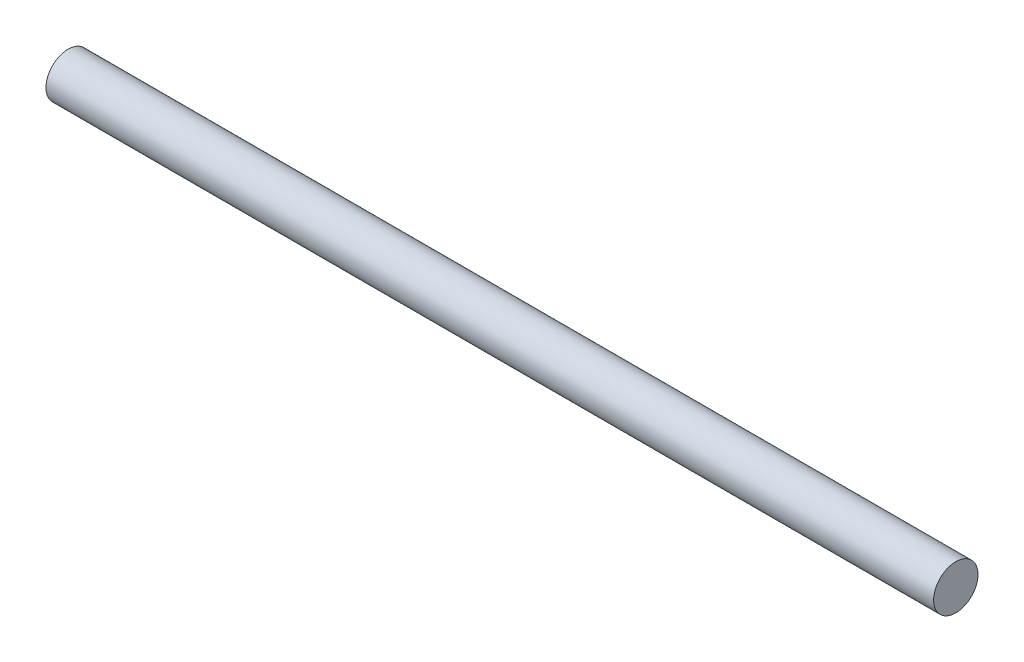
ISO-10303-21;
HEADER;
FILE_DESCRIPTION(('STEP AP214'),'2;1');
FILE_NAME('part.step','',(''),(''),'','','');
FILE_SCHEMA(('AUTOMOTIVE_DESIGN { 1 0 10303 214 1 1 1 1 }'));
ENDSEC;
DATA;
#1=APPLICATION_CONTEXT('core data for automotive mechanical design processes');
#2=APPLICATION_PROTOCOL_DEFINITION('international standard','automotive_design',2000,#1);
#3=PRODUCT_CONTEXT('',#1,'mechanical');
#4=PRODUCT('Part','Part','',(#3));
#5=PRODUCT_RELATED_PRODUCT_CATEGORY('part','',(#4));
#6=PRODUCT_DEFINITION_FORMATION('','',#4);
#7=PRODUCT_DEFINITION_CONTEXT('part definition',#1,'design');
#8=PRODUCT_DEFINITION('design','',#6,#7);
#9=PRODUCT_DEFINITION_SHAPE('','',#8);
#10=(LENGTH_UNIT() NAMED_UNIT(*) SI_UNIT(.MILLI.,.METRE.));
#11=(NAMED_UNIT(*) PLANE_ANGLE_UNIT() SI_UNIT($,.RADIAN.));
#12=(NAMED_UNIT(*) SI_UNIT($,.STERADIAN.) SOLID_ANGLE_UNIT());
#13=UNCERTAINTY_MEASURE_WITH_UNIT(LENGTH_MEASURE(1.E-05),#10,'distance_accuracy_value','');
#14=(GEOMETRIC_REPRESENTATION_CONTEXT(3) GLOBAL_UNCERTAINTY_ASSIGNED_CONTEXT((#13)) GLOBAL_UNIT_ASSIGNED_CONTEXT((#10,
#11,#12)) REPRESENTATION_CONTEXT('',''));
#15=CARTESIAN_POINT('',(0.,0.,0.));
#16=DIRECTION('',(0.,0.,1.));
#17=DIRECTION('',(1.,0.,0.));
#18=AXIS2_PLACEMENT_3D('',#15,#16,#17);
#19=CARTESIAN_POINT('',(508.,0.,0.));
#20=DIRECTION('',(-1.,0.,0.));
#21=DIRECTION('',(0.,0.,1.));
#22=AXIS2_PLACEMENT_3D('',#19,#20,#21);
#23=CYLINDRICAL_SURFACE('',#22,12.7);
#24=CARTESIAN_POINT('',(508.,0.,0.));
#25=DIRECTION('',(1.,0.,0.));
#26=DIRECTION('',(0.,0.,-1.));
#27=AXIS2_PLACEMENT_3D('',#24,#25,#26);
#28=CIRCLE('',#27,12.7);
#29=CARTESIAN_POINT('',(508.,0.,-12.7));
#30=VERTEX_POINT('',#29);
#31=EDGE_CURVE('E10',#30,#30,#28,.T.);
#32=ORIENTED_EDGE('',*,*,#31,.F.);
#33=EDGE_LOOP('',(#32));
#34=FACE_BOUND('',#33,.T.);
#35=CARTESIAN_POINT('',(0.,0.,0.));
#36=DIRECTION('',(1.,0.,0.));
#37=DIRECTION('',(0.,0.,-1.));
#38=AXIS2_PLACEMENT_3D('',#35,#36,#37);
#39=CIRCLE('',#38,12.7);
#40=CARTESIAN_POINT('',(0.,0.,-12.7));
#41=VERTEX_POINT('',#40);
#42=EDGE_CURVE('E34',#41,#41,#39,.T.);
#43=ORIENTED_EDGE('',*,*,#42,.T.);
#44=EDGE_LOOP('',(#43));
#45=FACE_BOUND('',#44,.T.);
#46=ADVANCED_FACE('F31',(#34,#45),#23,.T.);
#47=CARTESIAN_POINT('',(508.,0.,0.));
#48=DIRECTION('',(1.,0.,0.));
#49=DIRECTION('',(0.,0.,-1.));
#50=AXIS2_PLACEMENT_3D('',#47,#48,#49);
#51=PLANE('',#50);
#52=ORIENTED_EDGE('',*,*,#31,.T.);
#53=EDGE_LOOP('',(#52));
#54=FACE_BOUND('',#53,.T.);
#55=ADVANCED_FACE('F46',(#54),#51,.T.);
#56=CARTESIAN_POINT('',(0.,0.,0.));
#57=DIRECTION('',(1.,0.,0.));
#58=DIRECTION('',(0.,0.,-1.));
#59=AXIS2_PLACEMENT_3D('',#56,#57,#58);
#60=PLANE('',#59);
#61=ORIENTED_EDGE('',*,*,#42,.F.);
#62=EDGE_LOOP('',(#61));
#63=FACE_BOUND('',#62,.T.);
#64=ADVANCED_FACE('F44',(#63),#60,.F.);
#65=CLOSED_SHELL('',(#46,#55,#64));
#66=MANIFOLD_SOLID_BREP('B2',#65);
#67=ADVANCED_BREP_SHAPE_REPRESENTATION('',(#18,#66),#14);
#68=SHAPE_DEFINITION_REPRESENTATION(#9,#67);
ENDSEC;
END-ISO-10303-21;
